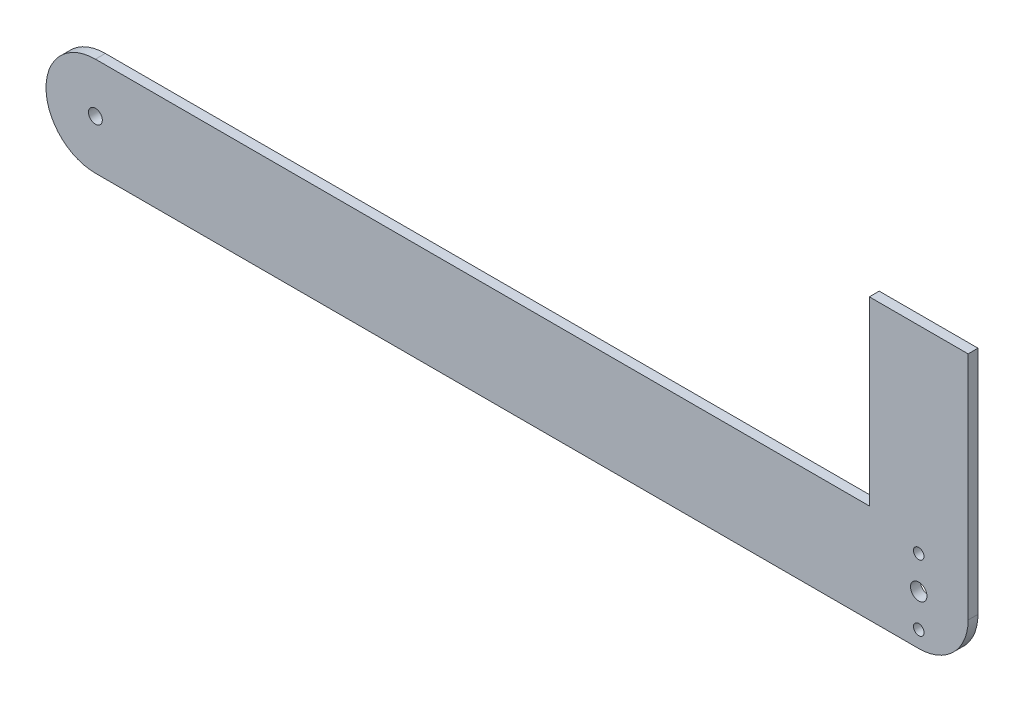
ISO-10303-21;
HEADER;
FILE_DESCRIPTION(('STEP AP214'),'2;1');
FILE_NAME('part.step','',(''),(''),'','','');
FILE_SCHEMA(('AUTOMOTIVE_DESIGN { 1 0 10303 214 1 1 1 1 }'));
ENDSEC;
DATA;
#1=APPLICATION_CONTEXT('core data for automotive mechanical design processes');
#2=APPLICATION_PROTOCOL_DEFINITION('international standard','automotive_design',2000,#1);
#3=PRODUCT_CONTEXT('',#1,'mechanical');
#4=PRODUCT('Part','Part','',(#3));
#5=PRODUCT_RELATED_PRODUCT_CATEGORY('part','',(#4));
#6=PRODUCT_DEFINITION_FORMATION('','',#4);
#7=PRODUCT_DEFINITION_CONTEXT('part definition',#1,'design');
#8=PRODUCT_DEFINITION('design','',#6,#7);
#9=PRODUCT_DEFINITION_SHAPE('','',#8);
#10=(LENGTH_UNIT() NAMED_UNIT(*) SI_UNIT(.MILLI.,.METRE.));
#11=(NAMED_UNIT(*) PLANE_ANGLE_UNIT() SI_UNIT($,.RADIAN.));
#12=(NAMED_UNIT(*) SI_UNIT($,.STERADIAN.) SOLID_ANGLE_UNIT());
#13=UNCERTAINTY_MEASURE_WITH_UNIT(LENGTH_MEASURE(1.E-05),#10,'distance_accuracy_value','');
#14=(GEOMETRIC_REPRESENTATION_CONTEXT(3) GLOBAL_UNCERTAINTY_ASSIGNED_CONTEXT((#13)) GLOBAL_UNIT_ASSIGNED_CONTEXT((#10,
#11,#12)) REPRESENTATION_CONTEXT('',''));
#15=CARTESIAN_POINT('',(0.,0.,0.));
#16=DIRECTION('',(0.,0.,1.));
#17=DIRECTION('',(1.,0.,0.));
#18=AXIS2_PLACEMENT_3D('',#15,#16,#17);
#19=CARTESIAN_POINT('',(125.,0.,3.));
#20=DIRECTION('',(0.,0.,-1.));
#21=DIRECTION('',(-1.,0.,0.));
#22=AXIS2_PLACEMENT_3D('',#19,#20,#21);
#23=CYLINDRICAL_SURFACE('',#22,15.);
#24=DIRECTION('',(0.,0.,1.));
#25=VECTOR('',#24,1.);
#26=CARTESIAN_POINT('',(140.,0.,0.));
#27=LINE('',#26,#25);
#28=CARTESIAN_POINT('',(140.,0.,0.));
#29=VERTEX_POINT('',#28);
#30=CARTESIAN_POINT('',(140.,0.,3.));
#31=VERTEX_POINT('',#30);
#32=EDGE_CURVE('E108',#29,#31,#27,.T.);
#33=ORIENTED_EDGE('',*,*,#32,.T.);
#34=CARTESIAN_POINT('',(125.,0.,3.));
#35=DIRECTION('',(0.,0.,1.));
#36=DIRECTION('',(-1.,0.,0.));
#37=AXIS2_PLACEMENT_3D('',#34,#35,#36);
#38=CIRCLE('',#37,15.);
#39=CARTESIAN_POINT('',(125.,-15.,3.));
#40=VERTEX_POINT('',#39);
#41=EDGE_CURVE('E144',#40,#31,#38,.T.);
#42=ORIENTED_EDGE('',*,*,#41,.F.);
#43=DIRECTION('',(0.,0.,-1.));
#44=VECTOR('',#43,1.);
#45=CARTESIAN_POINT('',(125.,-15.,3.));
#46=LINE('',#45,#44);
#47=CARTESIAN_POINT('',(125.,-15.,0.));
#48=VERTEX_POINT('',#47);
#49=EDGE_CURVE('E130',#40,#48,#46,.T.);
#50=ORIENTED_EDGE('',*,*,#49,.T.);
#51=CARTESIAN_POINT('',(125.,0.,0.));
#52=DIRECTION('',(0.,0.,1.));
#53=DIRECTION('',(-1.,0.,0.));
#54=AXIS2_PLACEMENT_3D('',#51,#52,#53);
#55=CIRCLE('',#54,15.);
#56=EDGE_CURVE('E125',#48,#29,#55,.T.);
#57=ORIENTED_EDGE('',*,*,#56,.T.);
#58=EDGE_LOOP('',(#33,#42,#50,#57));
#59=FACE_BOUND('',#58,.T.);
#60=ADVANCED_FACE('F41',(#59),#23,.T.);
#61=CARTESIAN_POINT('',(125.,0.,3.));
#62=DIRECTION('',(0.,0.,-1.));
#63=DIRECTION('',(-1.,0.,0.));
#64=AXIS2_PLACEMENT_3D('',#61,#62,#63);
#65=PLANE('',#64);
#66=CARTESIAN_POINT('',(125.,0.,3.));
#67=DIRECTION('',(0.,0.,1.));
#68=DIRECTION('',(1.,0.,0.));
#69=AXIS2_PLACEMENT_3D('',#66,#67,#68);
#70=CIRCLE('',#69,2.5);
#71=CARTESIAN_POINT('',(127.5,0.,3.));
#72=VERTEX_POINT('',#71);
#73=EDGE_CURVE('E182',#72,#72,#70,.T.);
#74=ORIENTED_EDGE('',*,*,#73,.F.);
#75=EDGE_LOOP('',(#74));
#76=FACE_BOUND('',#75,.T.);
#77=CARTESIAN_POINT('',(-125.,0.,3.));
#78=DIRECTION('',(0.,0.,1.));
#79=DIRECTION('',(1.,0.,0.));
#80=AXIS2_PLACEMENT_3D('',#77,#78,#79);
#81=CIRCLE('',#80,2.1);
#82=CARTESIAN_POINT('',(-122.9,0.,3.));
#83=VERTEX_POINT('',#82);
#84=EDGE_CURVE('E132',#83,#83,#81,.T.);
#85=ORIENTED_EDGE('',*,*,#84,.F.);
#86=EDGE_LOOP('',(#85));
#87=FACE_BOUND('',#86,.T.);
#88=ORIENTED_EDGE('',*,*,#41,.T.);
#89=DIRECTION('',(0.,1.,0.));
#90=VECTOR('',#89,1.);
#91=CARTESIAN_POINT('',(140.,70.,3.));
#92=LINE('',#91,#90);
#93=CARTESIAN_POINT('',(140.,70.,3.));
#94=VERTEX_POINT('',#93);
#95=EDGE_CURVE('E113',#31,#94,#92,.T.);
#96=ORIENTED_EDGE('',*,*,#95,.T.);
#97=DIRECTION('',(-1.,0.,0.));
#98=VECTOR('',#97,1.);
#99=CARTESIAN_POINT('',(110.,70.,3.));
#100=LINE('',#99,#98);
#101=CARTESIAN_POINT('',(110.,70.,3.));
#102=VERTEX_POINT('',#101);
#103=EDGE_CURVE('E164',#94,#102,#100,.T.);
#104=ORIENTED_EDGE('',*,*,#103,.T.);
#105=DIRECTION('',(0.,-1.,0.));
#106=VECTOR('',#105,1.);
#107=CARTESIAN_POINT('',(110.,70.,3.));
#108=LINE('',#107,#106);
#109=CARTESIAN_POINT('',(110.,15.,3.));
#110=VERTEX_POINT('',#109);
#111=EDGE_CURVE('E55',#102,#110,#108,.T.);
#112=ORIENTED_EDGE('',*,*,#111,.T.);
#113=DIRECTION('',(-1.,0.,0.));
#114=VECTOR('',#113,1.);
#115=CARTESIAN_POINT('',(-125.,15.,3.));
#116=LINE('',#115,#114);
#117=CARTESIAN_POINT('',(-125.,15.,3.));
#118=VERTEX_POINT('',#117);
#119=EDGE_CURVE('E83',#110,#118,#116,.T.);
#120=ORIENTED_EDGE('',*,*,#119,.T.);
#121=CARTESIAN_POINT('',(-125.,0.,3.));
#122=DIRECTION('',(0.,0.,1.));
#123=DIRECTION('',(1.,0.,0.));
#124=AXIS2_PLACEMENT_3D('',#121,#122,#123);
#125=CIRCLE('',#124,15.);
#126=CARTESIAN_POINT('',(-125.,-15.,3.));
#127=VERTEX_POINT('',#126);
#128=EDGE_CURVE('E153',#118,#127,#125,.T.);
#129=ORIENTED_EDGE('',*,*,#128,.T.);
#130=DIRECTION('',(1.,0.,0.));
#131=VECTOR('',#130,1.);
#132=CARTESIAN_POINT('',(-125.,-15.,3.));
#133=LINE('',#132,#131);
#134=EDGE_CURVE('E63',#127,#40,#133,.T.);
#135=ORIENTED_EDGE('',*,*,#134,.T.);
#136=EDGE_LOOP('',(#88,#96,#104,#112,#120,#129,#135));
#137=FACE_BOUND('',#136,.T.);
#138=CARTESIAN_POINT('',(125.,-10.,3.));
#139=DIRECTION('',(0.,0.,1.));
#140=DIRECTION('',(-1.,0.,0.));
#141=AXIS2_PLACEMENT_3D('',#138,#139,#140);
#142=CIRCLE('',#141,1.59999999999999);
#143=CARTESIAN_POINT('',(123.4,-10.,3.));
#144=VERTEX_POINT('',#143);
#145=EDGE_CURVE('E170',#144,#144,#142,.T.);
#146=ORIENTED_EDGE('',*,*,#145,.F.);
#147=EDGE_LOOP('',(#146));
#148=FACE_BOUND('',#147,.T.);
#149=CARTESIAN_POINT('',(125.,10.,3.));
#150=DIRECTION('',(0.,0.,1.));
#151=DIRECTION('',(1.,0.,0.));
#152=AXIS2_PLACEMENT_3D('',#149,#150,#151);
#153=CIRCLE('',#152,1.59999999999999);
#154=CARTESIAN_POINT('',(126.6,10.,3.));
#155=VERTEX_POINT('',#154);
#156=EDGE_CURVE('E176',#155,#155,#153,.T.);
#157=ORIENTED_EDGE('',*,*,#156,.F.);
#158=EDGE_LOOP('',(#157));
#159=FACE_BOUND('',#158,.T.);
#160=ADVANCED_FACE('F190',(#76,#87,#137,#148,#159),#65,.F.);
#161=CARTESIAN_POINT('',(125.,0.,0.));
#162=DIRECTION('',(0.,0.,-1.));
#163=DIRECTION('',(-1.,0.,0.));
#164=AXIS2_PLACEMENT_3D('',#161,#162,#163);
#165=PLANE('',#164);
#166=CARTESIAN_POINT('',(125.,0.,0.));
#167=DIRECTION('',(0.,0.,1.));
#168=DIRECTION('',(1.,0.,0.));
#169=AXIS2_PLACEMENT_3D('',#166,#167,#168);
#170=CIRCLE('',#169,2.5);
#171=CARTESIAN_POINT('',(127.5,0.,0.));
#172=VERTEX_POINT('',#171);
#173=EDGE_CURVE('E179',#172,#172,#170,.T.);
#174=ORIENTED_EDGE('',*,*,#173,.T.);
#175=EDGE_LOOP('',(#174));
#176=FACE_BOUND('',#175,.T.);
#177=DIRECTION('',(0.,1.,0.));
#178=VECTOR('',#177,1.);
#179=CARTESIAN_POINT('',(140.,70.,0.));
#180=LINE('',#179,#178);
#181=CARTESIAN_POINT('',(140.,70.,0.));
#182=VERTEX_POINT('',#181);
#183=EDGE_CURVE('E111',#29,#182,#180,.T.);
#184=ORIENTED_EDGE('',*,*,#183,.F.);
#185=ORIENTED_EDGE('',*,*,#56,.F.);
#186=DIRECTION('',(1.,0.,0.));
#187=VECTOR('',#186,1.);
#188=CARTESIAN_POINT('',(-125.,-15.,0.));
#189=LINE('',#188,#187);
#190=CARTESIAN_POINT('',(-125.,-15.,0.));
#191=VERTEX_POINT('',#190);
#192=EDGE_CURVE('E80',#191,#48,#189,.T.);
#193=ORIENTED_EDGE('',*,*,#192,.F.);
#194=CARTESIAN_POINT('',(-125.,0.,0.));
#195=DIRECTION('',(0.,0.,1.));
#196=DIRECTION('',(1.,0.,0.));
#197=AXIS2_PLACEMENT_3D('',#194,#195,#196);
#198=CIRCLE('',#197,15.);
#199=CARTESIAN_POINT('',(-125.,15.,0.));
#200=VERTEX_POINT('',#199);
#201=EDGE_CURVE('E134',#200,#191,#198,.T.);
#202=ORIENTED_EDGE('',*,*,#201,.F.);
#203=DIRECTION('',(-1.,0.,0.));
#204=VECTOR('',#203,1.);
#205=CARTESIAN_POINT('',(-125.,15.,0.));
#206=LINE('',#205,#204);
#207=CARTESIAN_POINT('',(110.,15.,0.));
#208=VERTEX_POINT('',#207);
#209=EDGE_CURVE('E131',#208,#200,#206,.T.);
#210=ORIENTED_EDGE('',*,*,#209,.F.);
#211=DIRECTION('',(0.,-1.,0.));
#212=VECTOR('',#211,1.);
#213=CARTESIAN_POINT('',(110.,70.,0.));
#214=LINE('',#213,#212);
#215=CARTESIAN_POINT('',(110.,70.,0.));
#216=VERTEX_POINT('',#215);
#217=EDGE_CURVE('E118',#216,#208,#214,.T.);
#218=ORIENTED_EDGE('',*,*,#217,.F.);
#219=DIRECTION('',(-1.,0.,0.));
#220=VECTOR('',#219,1.);
#221=CARTESIAN_POINT('',(110.,70.,0.));
#222=LINE('',#221,#220);
#223=EDGE_CURVE('E128',#182,#216,#222,.T.);
#224=ORIENTED_EDGE('',*,*,#223,.F.);
#225=EDGE_LOOP('',(#184,#185,#193,#202,#210,#218,#224));
#226=FACE_BOUND('',#225,.T.);
#227=CARTESIAN_POINT('',(-125.,0.,0.));
#228=DIRECTION('',(0.,0.,1.));
#229=DIRECTION('',(1.,0.,0.));
#230=AXIS2_PLACEMENT_3D('',#227,#228,#229);
#231=CIRCLE('',#230,2.1);
#232=CARTESIAN_POINT('',(-122.9,0.,0.));
#233=VERTEX_POINT('',#232);
#234=EDGE_CURVE('E137',#233,#233,#231,.T.);
#235=ORIENTED_EDGE('',*,*,#234,.T.);
#236=EDGE_LOOP('',(#235));
#237=FACE_BOUND('',#236,.T.);
#238=CARTESIAN_POINT('',(125.,-10.,0.));
#239=DIRECTION('',(0.,0.,1.));
#240=DIRECTION('',(-1.,0.,0.));
#241=AXIS2_PLACEMENT_3D('',#238,#239,#240);
#242=CIRCLE('',#241,1.59999999999999);
#243=CARTESIAN_POINT('',(123.4,-10.,0.));
#244=VERTEX_POINT('',#243);
#245=EDGE_CURVE('E168',#244,#244,#242,.T.);
#246=ORIENTED_EDGE('',*,*,#245,.T.);
#247=EDGE_LOOP('',(#246));
#248=FACE_BOUND('',#247,.T.);
#249=CARTESIAN_POINT('',(125.,10.,0.));
#250=DIRECTION('',(0.,0.,1.));
#251=DIRECTION('',(1.,0.,0.));
#252=AXIS2_PLACEMENT_3D('',#249,#250,#251);
#253=CIRCLE('',#252,1.59999999999999);
#254=CARTESIAN_POINT('',(126.6,10.,0.));
#255=VERTEX_POINT('',#254);
#256=EDGE_CURVE('E173',#255,#255,#253,.T.);
#257=ORIENTED_EDGE('',*,*,#256,.T.);
#258=EDGE_LOOP('',(#257));
#259=FACE_BOUND('',#258,.T.);
#260=ADVANCED_FACE('F123',(#176,#226,#237,#248,#259),#165,.T.);
#261=CARTESIAN_POINT('',(-125.,15.,3.));
#262=DIRECTION('',(0.,-1.,0.));
#263=DIRECTION('',(0.,0.,-1.));
#264=AXIS2_PLACEMENT_3D('',#261,#262,#263);
#265=PLANE('',#264);
#266=ORIENTED_EDGE('',*,*,#119,.F.);
#267=DIRECTION('',(0.,0.,-1.));
#268=VECTOR('',#267,1.);
#269=CARTESIAN_POINT('',(110.,15.,3.));
#270=LINE('',#269,#268);
#271=EDGE_CURVE('E11',#110,#208,#270,.T.);
#272=ORIENTED_EDGE('',*,*,#271,.T.);
#273=ORIENTED_EDGE('',*,*,#209,.T.);
#274=DIRECTION('',(0.,0.,-1.));
#275=VECTOR('',#274,1.);
#276=CARTESIAN_POINT('',(-125.,15.,3.));
#277=LINE('',#276,#275);
#278=EDGE_CURVE('E48',#118,#200,#277,.T.);
#279=ORIENTED_EDGE('',*,*,#278,.F.);
#280=EDGE_LOOP('',(#266,#272,#273,#279));
#281=FACE_BOUND('',#280,.T.);
#282=ADVANCED_FACE('F156',(#281),#265,.F.);
#283=CARTESIAN_POINT('',(-125.,0.,3.));
#284=DIRECTION('',(0.,0.,-1.));
#285=DIRECTION('',(-1.,0.,0.));
#286=AXIS2_PLACEMENT_3D('',#283,#284,#285);
#287=CYLINDRICAL_SURFACE('',#286,15.);
#288=ORIENTED_EDGE('',*,*,#201,.T.);
#289=DIRECTION('',(0.,0.,-1.));
#290=VECTOR('',#289,1.);
#291=CARTESIAN_POINT('',(-125.,-15.,3.));
#292=LINE('',#291,#290);
#293=EDGE_CURVE('E146',#127,#191,#292,.T.);
#294=ORIENTED_EDGE('',*,*,#293,.F.);
#295=ORIENTED_EDGE('',*,*,#128,.F.);
#296=ORIENTED_EDGE('',*,*,#278,.T.);
#297=EDGE_LOOP('',(#288,#294,#295,#296));
#298=FACE_BOUND('',#297,.T.);
#299=ADVANCED_FACE('F151',(#298),#287,.T.);
#300=CARTESIAN_POINT('',(-125.,-15.,3.));
#301=DIRECTION('',(0.,1.,0.));
#302=DIRECTION('',(0.,0.,1.));
#303=AXIS2_PLACEMENT_3D('',#300,#301,#302);
#304=PLANE('',#303);
#305=ORIENTED_EDGE('',*,*,#192,.T.);
#306=ORIENTED_EDGE('',*,*,#49,.F.);
#307=ORIENTED_EDGE('',*,*,#134,.F.);
#308=ORIENTED_EDGE('',*,*,#293,.T.);
#309=EDGE_LOOP('',(#305,#306,#307,#308));
#310=FACE_BOUND('',#309,.T.);
#311=ADVANCED_FACE('F192',(#310),#304,.F.);
#312=CARTESIAN_POINT('',(-125.,0.,3.));
#313=DIRECTION('',(0.,0.,-1.));
#314=DIRECTION('',(-1.,0.,0.));
#315=AXIS2_PLACEMENT_3D('',#312,#313,#314);
#316=CYLINDRICAL_SURFACE('',#315,2.1);
#317=ORIENTED_EDGE('',*,*,#84,.T.);
#318=EDGE_LOOP('',(#317));
#319=FACE_BOUND('',#318,.T.);
#320=ORIENTED_EDGE('',*,*,#234,.F.);
#321=EDGE_LOOP('',(#320));
#322=FACE_BOUND('',#321,.T.);
#323=ADVANCED_FACE('F219',(#319,#322),#316,.F.);
#324=CARTESIAN_POINT('',(125.,0.,3.));
#325=DIRECTION('',(0.,0.,-1.));
#326=DIRECTION('',(-1.,0.,0.));
#327=AXIS2_PLACEMENT_3D('',#324,#325,#326);
#328=CYLINDRICAL_SURFACE('',#327,2.5);
#329=ORIENTED_EDGE('',*,*,#73,.T.);
#330=EDGE_LOOP('',(#329));
#331=FACE_BOUND('',#330,.T.);
#332=ORIENTED_EDGE('',*,*,#173,.F.);
#333=EDGE_LOOP('',(#332));
#334=FACE_BOUND('',#333,.T.);
#335=ADVANCED_FACE('F245',(#331,#334),#328,.F.);
#336=CARTESIAN_POINT('',(125.,10.,3.));
#337=DIRECTION('',(0.,0.,-1.));
#338=DIRECTION('',(-1.,0.,0.));
#339=AXIS2_PLACEMENT_3D('',#336,#337,#338);
#340=CYLINDRICAL_SURFACE('',#339,1.59999999999999);
#341=ORIENTED_EDGE('',*,*,#156,.T.);
#342=EDGE_LOOP('',(#341));
#343=FACE_BOUND('',#342,.T.);
#344=ORIENTED_EDGE('',*,*,#256,.F.);
#345=EDGE_LOOP('',(#344));
#346=FACE_BOUND('',#345,.T.);
#347=ADVANCED_FACE('F252',(#343,#346),#340,.F.);
#348=CARTESIAN_POINT('',(125.,-10.,3.));
#349=DIRECTION('',(0.,0.,-1.));
#350=DIRECTION('',(-1.,0.,0.));
#351=AXIS2_PLACEMENT_3D('',#348,#349,#350);
#352=CYLINDRICAL_SURFACE('',#351,1.59999999999999);
#353=ORIENTED_EDGE('',*,*,#145,.T.);
#354=EDGE_LOOP('',(#353));
#355=FACE_BOUND('',#354,.T.);
#356=ORIENTED_EDGE('',*,*,#245,.F.);
#357=EDGE_LOOP('',(#356));
#358=FACE_BOUND('',#357,.T.);
#359=ADVANCED_FACE('F203',(#355,#358),#352,.F.);
#360=CARTESIAN_POINT('',(110.,70.,0.));
#361=DIRECTION('',(-1.,0.,0.));
#362=DIRECTION('',(0.,-1.,0.));
#363=AXIS2_PLACEMENT_3D('',#360,#361,#362);
#364=PLANE('',#363);
#365=ORIENTED_EDGE('',*,*,#271,.F.);
#366=ORIENTED_EDGE('',*,*,#111,.F.);
#367=DIRECTION('',(0.,0.,1.));
#368=VECTOR('',#367,1.);
#369=CARTESIAN_POINT('',(110.,70.,0.));
#370=LINE('',#369,#368);
#371=EDGE_CURVE('E159',#216,#102,#370,.T.);
#372=ORIENTED_EDGE('',*,*,#371,.F.);
#373=ORIENTED_EDGE('',*,*,#217,.T.);
#374=EDGE_LOOP('',(#365,#366,#372,#373));
#375=FACE_BOUND('',#374,.T.);
#376=ADVANCED_FACE('F158',(#375),#364,.T.);
#377=CARTESIAN_POINT('',(110.,70.,0.));
#378=DIRECTION('',(0.,1.,0.));
#379=DIRECTION('',(0.,0.,1.));
#380=AXIS2_PLACEMENT_3D('',#377,#378,#379);
#381=PLANE('',#380);
#382=ORIENTED_EDGE('',*,*,#103,.F.);
#383=DIRECTION('',(0.,0.,1.));
#384=VECTOR('',#383,1.);
#385=CARTESIAN_POINT('',(140.,70.,0.));
#386=LINE('',#385,#384);
#387=EDGE_CURVE('E117',#182,#94,#386,.T.);
#388=ORIENTED_EDGE('',*,*,#387,.F.);
#389=ORIENTED_EDGE('',*,*,#223,.T.);
#390=ORIENTED_EDGE('',*,*,#371,.T.);
#391=EDGE_LOOP('',(#382,#388,#389,#390));
#392=FACE_BOUND('',#391,.T.);
#393=ADVANCED_FACE('F195',(#392),#381,.T.);
#394=CARTESIAN_POINT('',(140.,70.,0.));
#395=DIRECTION('',(1.,0.,0.));
#396=DIRECTION('',(0.,0.,-1.));
#397=AXIS2_PLACEMENT_3D('',#394,#395,#396);
#398=PLANE('',#397);
#399=ORIENTED_EDGE('',*,*,#95,.F.);
#400=ORIENTED_EDGE('',*,*,#32,.F.);
#401=ORIENTED_EDGE('',*,*,#183,.T.);
#402=ORIENTED_EDGE('',*,*,#387,.T.);
#403=EDGE_LOOP('',(#399,#400,#401,#402));
#404=FACE_BOUND('',#403,.T.);
#405=ADVANCED_FACE('F110',(#404),#398,.T.);
#406=CLOSED_SHELL('',(#60,#160,#260,#282,#299,#311,#323,#335,#347,#359,#376,#393,#405));
#407=MANIFOLD_SOLID_BREP('B2',#406);
#408=ADVANCED_BREP_SHAPE_REPRESENTATION('',(#18,#407),#14);
#409=SHAPE_DEFINITION_REPRESENTATION(#9,#408);
ENDSEC;
END-ISO-10303-21;
